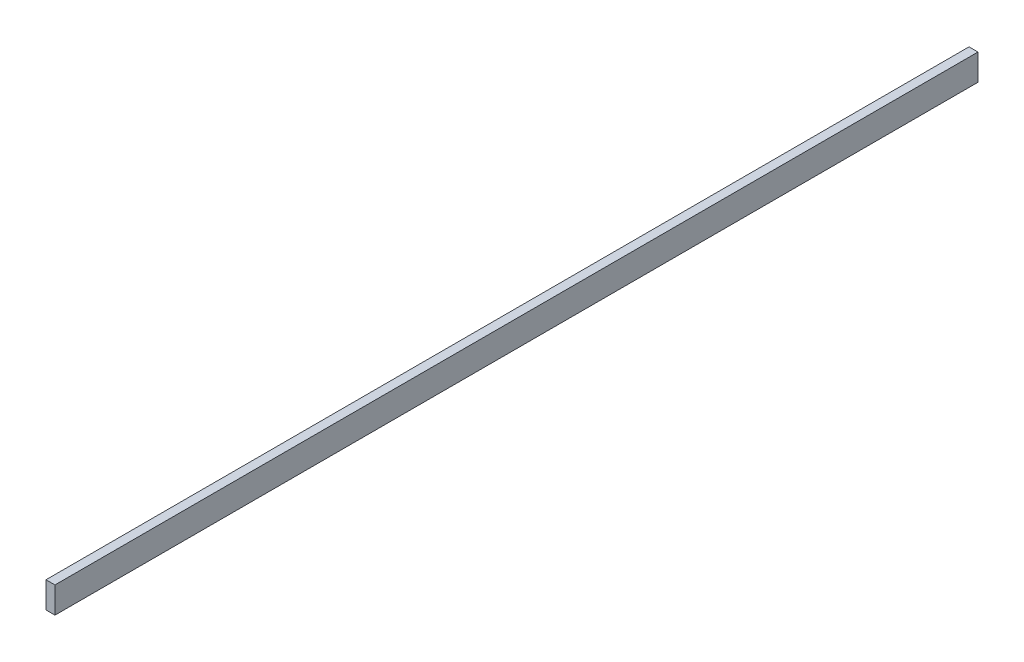
ISO-10303-21;
HEADER;
FILE_DESCRIPTION(('STEP AP214'),'2;1');
FILE_NAME('part.step','',(''),(''),'','','');
FILE_SCHEMA(('AUTOMOTIVE_DESIGN { 1 0 10303 214 1 1 1 1 }'));
ENDSEC;
DATA;
#1=APPLICATION_CONTEXT('core data for automotive mechanical design processes');
#2=APPLICATION_PROTOCOL_DEFINITION('international standard','automotive_design',2000,#1);
#3=PRODUCT_CONTEXT('',#1,'mechanical');
#4=PRODUCT('Part','Part','',(#3));
#5=PRODUCT_RELATED_PRODUCT_CATEGORY('part','',(#4));
#6=PRODUCT_DEFINITION_FORMATION('','',#4);
#7=PRODUCT_DEFINITION_CONTEXT('part definition',#1,'design');
#8=PRODUCT_DEFINITION('design','',#6,#7);
#9=PRODUCT_DEFINITION_SHAPE('','',#8);
#10=(LENGTH_UNIT() NAMED_UNIT(*) SI_UNIT(.MILLI.,.METRE.));
#11=(NAMED_UNIT(*) PLANE_ANGLE_UNIT() SI_UNIT($,.RADIAN.));
#12=(NAMED_UNIT(*) SI_UNIT($,.STERADIAN.) SOLID_ANGLE_UNIT());
#13=UNCERTAINTY_MEASURE_WITH_UNIT(LENGTH_MEASURE(1.E-05),#10,'distance_accuracy_value','');
#14=(GEOMETRIC_REPRESENTATION_CONTEXT(3) GLOBAL_UNCERTAINTY_ASSIGNED_CONTEXT((#13)) GLOBAL_UNIT_ASSIGNED_CONTEXT((#10,
#11,#12)) REPRESENTATION_CONTEXT('',''));
#15=CARTESIAN_POINT('',(0.,0.,0.));
#16=DIRECTION('',(0.,0.,1.));
#17=DIRECTION('',(1.,0.,0.));
#18=AXIS2_PLACEMENT_3D('',#15,#16,#17);
#19=CARTESIAN_POINT('',(6495.53723765959,4654.30777163097,1308.1));
#20=DIRECTION('',(0.,-1.,0.));
#21=DIRECTION('',(0.,0.,-1.));
#22=AXIS2_PLACEMENT_3D('',#19,#20,#21);
#23=PLANE('',#22);
#24=DIRECTION('',(-1.,0.,0.));
#25=VECTOR('',#24,1.);
#26=CARTESIAN_POINT('',(6495.53723765959,4654.30777163097,0.));
#27=LINE('',#26,#25);
#28=CARTESIAN_POINT('',(6495.53723765959,4654.30777163097,0.));
#29=VERTEX_POINT('',#28);
#30=CARTESIAN_POINT('',(6482.83723765959,4654.30777163097,0.));
#31=VERTEX_POINT('',#30);
#32=EDGE_CURVE('E100',#29,#31,#27,.T.);
#33=ORIENTED_EDGE('',*,*,#32,.T.);
#34=DIRECTION('',(0.,0.,-1.));
#35=VECTOR('',#34,1.);
#36=CARTESIAN_POINT('',(6482.83723765959,4654.30777163097,1308.1));
#37=LINE('',#36,#35);
#38=CARTESIAN_POINT('',(6482.83723765959,4654.30777163097,1308.1));
#39=VERTEX_POINT('',#38);
#40=EDGE_CURVE('E11',#39,#31,#37,.T.);
#41=ORIENTED_EDGE('',*,*,#40,.F.);
#42=DIRECTION('',(-1.,0.,0.));
#43=VECTOR('',#42,1.);
#44=CARTESIAN_POINT('',(6495.53723765959,4654.30777163097,1308.1));
#45=LINE('',#44,#43);
#46=CARTESIAN_POINT('',(6495.53723765959,4654.30777163097,1308.1));
#47=VERTEX_POINT('',#46);
#48=EDGE_CURVE('E88',#47,#39,#45,.T.);
#49=ORIENTED_EDGE('',*,*,#48,.F.);
#50=DIRECTION('',(0.,0.,-1.));
#51=VECTOR('',#50,1.);
#52=CARTESIAN_POINT('',(6495.53723765959,4654.30777163097,1308.1));
#53=LINE('',#52,#51);
#54=EDGE_CURVE('E96',#47,#29,#53,.T.);
#55=ORIENTED_EDGE('',*,*,#54,.T.);
#56=EDGE_LOOP('',(#33,#41,#49,#55));
#57=FACE_BOUND('',#56,.T.);
#58=ADVANCED_FACE('F37',(#57),#23,.F.);
#59=CARTESIAN_POINT('',(6482.83723765959,4654.30777163097,1308.1));
#60=DIRECTION('',(1.,0.,0.));
#61=DIRECTION('',(0.,1.,0.));
#62=AXIS2_PLACEMENT_3D('',#59,#60,#61);
#63=PLANE('',#62);
#64=DIRECTION('',(0.,-1.,0.));
#65=VECTOR('',#64,1.);
#66=CARTESIAN_POINT('',(6482.83723765959,4654.30777163097,0.));
#67=LINE('',#66,#65);
#68=CARTESIAN_POINT('',(6482.83723765959,4617.17480448802,0.));
#69=VERTEX_POINT('',#68);
#70=EDGE_CURVE('E92',#31,#69,#67,.T.);
#71=ORIENTED_EDGE('',*,*,#70,.T.);
#72=DIRECTION('',(0.,0.,-1.));
#73=VECTOR('',#72,1.);
#74=CARTESIAN_POINT('',(6482.83723765959,4617.17480448802,1308.1));
#75=LINE('',#74,#73);
#76=CARTESIAN_POINT('',(6482.83723765959,4617.17480448802,1308.1));
#77=VERTEX_POINT('',#76);
#78=EDGE_CURVE('E45',#77,#69,#75,.T.);
#79=ORIENTED_EDGE('',*,*,#78,.F.);
#80=DIRECTION('',(0.,-1.,0.));
#81=VECTOR('',#80,1.);
#82=CARTESIAN_POINT('',(6482.83723765959,4654.30777163097,1308.1));
#83=LINE('',#82,#81);
#84=EDGE_CURVE('E83',#39,#77,#83,.T.);
#85=ORIENTED_EDGE('',*,*,#84,.F.);
#86=ORIENTED_EDGE('',*,*,#40,.T.);
#87=EDGE_LOOP('',(#71,#79,#85,#86));
#88=FACE_BOUND('',#87,.T.);
#89=ADVANCED_FACE('F91',(#88),#63,.F.);
#90=CARTESIAN_POINT('',(6495.53723765959,4617.17480448802,1308.1));
#91=DIRECTION('',(0.,1.,0.));
#92=DIRECTION('',(0.,0.,1.));
#93=AXIS2_PLACEMENT_3D('',#90,#91,#92);
#94=PLANE('',#93);
#95=DIRECTION('',(1.,0.,0.));
#96=VECTOR('',#95,1.);
#97=CARTESIAN_POINT('',(6495.53723765959,4617.17480448802,0.));
#98=LINE('',#97,#96);
#99=CARTESIAN_POINT('',(6495.53723765959,4617.17480448802,0.));
#100=VERTEX_POINT('',#99);
#101=EDGE_CURVE('E70',#69,#100,#98,.T.);
#102=ORIENTED_EDGE('',*,*,#101,.T.);
#103=DIRECTION('',(0.,0.,-1.));
#104=VECTOR('',#103,1.);
#105=CARTESIAN_POINT('',(6495.53723765959,4617.17480448802,1308.1));
#106=LINE('',#105,#104);
#107=CARTESIAN_POINT('',(6495.53723765959,4617.17480448802,1308.1));
#108=VERTEX_POINT('',#107);
#109=EDGE_CURVE('E93',#108,#100,#106,.T.);
#110=ORIENTED_EDGE('',*,*,#109,.F.);
#111=DIRECTION('',(1.,0.,0.));
#112=VECTOR('',#111,1.);
#113=CARTESIAN_POINT('',(6495.53723765959,4617.17480448802,1308.1));
#114=LINE('',#113,#112);
#115=EDGE_CURVE('E86',#77,#108,#114,.T.);
#116=ORIENTED_EDGE('',*,*,#115,.F.);
#117=ORIENTED_EDGE('',*,*,#78,.T.);
#118=EDGE_LOOP('',(#102,#110,#116,#117));
#119=FACE_BOUND('',#118,.T.);
#120=ADVANCED_FACE('F94',(#119),#94,.F.);
#121=CARTESIAN_POINT('',(6495.53723765959,4654.30777163097,1308.1));
#122=DIRECTION('',(-1.,0.,0.));
#123=DIRECTION('',(0.,-1.,0.));
#124=AXIS2_PLACEMENT_3D('',#121,#122,#123);
#125=PLANE('',#124);
#126=DIRECTION('',(0.,1.,0.));
#127=VECTOR('',#126,1.);
#128=CARTESIAN_POINT('',(6495.53723765959,4654.30777163097,0.));
#129=LINE('',#128,#127);
#130=EDGE_CURVE('E76',#100,#29,#129,.T.);
#131=ORIENTED_EDGE('',*,*,#130,.T.);
#132=ORIENTED_EDGE('',*,*,#54,.F.);
#133=DIRECTION('',(0.,1.,0.));
#134=VECTOR('',#133,1.);
#135=CARTESIAN_POINT('',(6495.53723765959,4654.30777163097,1308.1));
#136=LINE('',#135,#134);
#137=EDGE_CURVE('E53',#108,#47,#136,.T.);
#138=ORIENTED_EDGE('',*,*,#137,.F.);
#139=ORIENTED_EDGE('',*,*,#109,.T.);
#140=EDGE_LOOP('',(#131,#132,#138,#139));
#141=FACE_BOUND('',#140,.T.);
#142=ADVANCED_FACE('F107',(#141),#125,.F.);
#143=CARTESIAN_POINT('',(0.,0.,1308.1));
#144=DIRECTION('',(0.,0.,1.));
#145=DIRECTION('',(1.,0.,0.));
#146=AXIS2_PLACEMENT_3D('',#143,#144,#145);
#147=PLANE('',#146);
#148=ORIENTED_EDGE('',*,*,#48,.T.);
#149=ORIENTED_EDGE('',*,*,#84,.T.);
#150=ORIENTED_EDGE('',*,*,#115,.T.);
#151=ORIENTED_EDGE('',*,*,#137,.T.);
#152=EDGE_LOOP('',(#148,#149,#150,#151));
#153=FACE_BOUND('',#152,.T.);
#154=ADVANCED_FACE('F84',(#153),#147,.T.);
#155=CARTESIAN_POINT('',(0.,0.,0.));
#156=DIRECTION('',(0.,0.,1.));
#157=DIRECTION('',(1.,0.,0.));
#158=AXIS2_PLACEMENT_3D('',#155,#156,#157);
#159=PLANE('',#158);
#160=ORIENTED_EDGE('',*,*,#32,.F.);
#161=ORIENTED_EDGE('',*,*,#130,.F.);
#162=ORIENTED_EDGE('',*,*,#101,.F.);
#163=ORIENTED_EDGE('',*,*,#70,.F.);
#164=EDGE_LOOP('',(#160,#161,#162,#163));
#165=FACE_BOUND('',#164,.T.);
#166=ADVANCED_FACE('F110',(#165),#159,.F.);
#167=CLOSED_SHELL('',(#58,#89,#120,#142,#154,#166));
#168=MANIFOLD_SOLID_BREP('B2',#167);
#169=ADVANCED_BREP_SHAPE_REPRESENTATION('',(#18,#168),#14);
#170=SHAPE_DEFINITION_REPRESENTATION(#9,#169);
ENDSEC;
END-ISO-10303-21;
